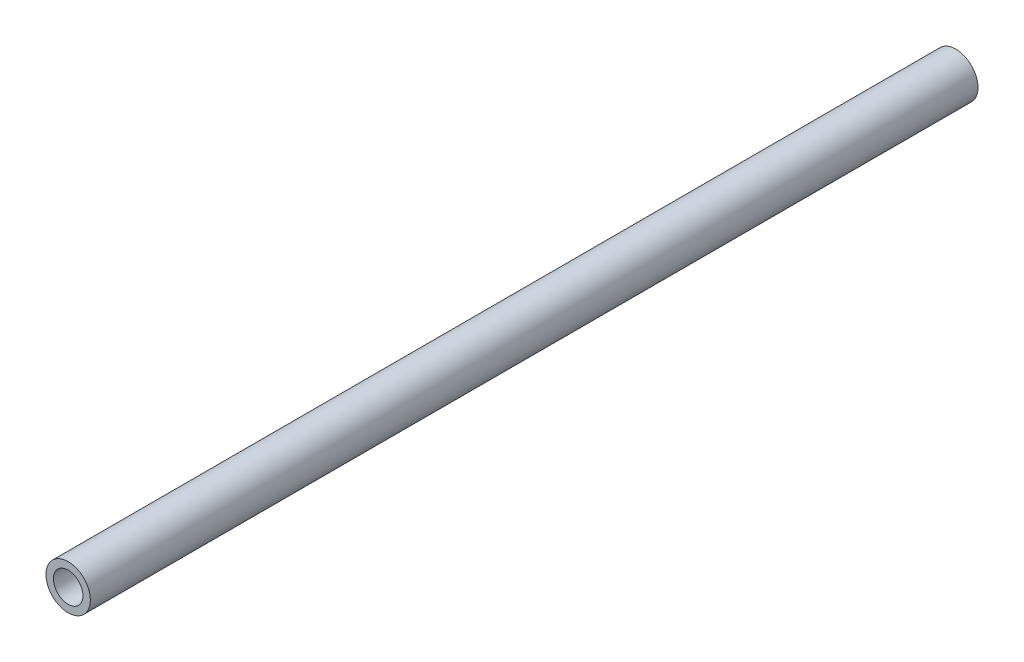
ISO-10303-21;
HEADER;
FILE_DESCRIPTION(('STEP AP214'),'2;1');
FILE_NAME('part.step','',(''),(''),'','','');
FILE_SCHEMA(('AUTOMOTIVE_DESIGN { 1 0 10303 214 1 1 1 1 }'));
ENDSEC;
DATA;
#1=APPLICATION_CONTEXT('core data for automotive mechanical design processes');
#2=APPLICATION_PROTOCOL_DEFINITION('international standard','automotive_design',2000,#1);
#3=PRODUCT_CONTEXT('',#1,'mechanical');
#4=PRODUCT('Part','Part','',(#3));
#5=PRODUCT_RELATED_PRODUCT_CATEGORY('part','',(#4));
#6=PRODUCT_DEFINITION_FORMATION('','',#4);
#7=PRODUCT_DEFINITION_CONTEXT('part definition',#1,'design');
#8=PRODUCT_DEFINITION('design','',#6,#7);
#9=PRODUCT_DEFINITION_SHAPE('','',#8);
#10=(LENGTH_UNIT() NAMED_UNIT(*) SI_UNIT(.MILLI.,.METRE.));
#11=(NAMED_UNIT(*) PLANE_ANGLE_UNIT() SI_UNIT($,.RADIAN.));
#12=(NAMED_UNIT(*) SI_UNIT($,.STERADIAN.) SOLID_ANGLE_UNIT());
#13=UNCERTAINTY_MEASURE_WITH_UNIT(LENGTH_MEASURE(1.E-05),#10,'distance_accuracy_value','');
#14=(GEOMETRIC_REPRESENTATION_CONTEXT(3) GLOBAL_UNCERTAINTY_ASSIGNED_CONTEXT((#13)) GLOBAL_UNIT_ASSIGNED_CONTEXT((#10,
#11,#12)) REPRESENTATION_CONTEXT('',''));
#15=CARTESIAN_POINT('',(0.,0.,0.));
#16=DIRECTION('',(0.,0.,1.));
#17=DIRECTION('',(1.,0.,0.));
#18=AXIS2_PLACEMENT_3D('',#15,#16,#17);
#19=CARTESIAN_POINT('',(0.,0.,381.));
#20=DIRECTION('',(0.,0.,1.));
#21=DIRECTION('',(1.,0.,0.));
#22=AXIS2_PLACEMENT_3D('',#19,#20,#21);
#23=PLANE('',#22);
#24=CARTESIAN_POINT('',(0.,0.,381.));
#25=DIRECTION('',(0.,0.,1.));
#26=DIRECTION('',(1.,0.,0.));
#27=AXIS2_PLACEMENT_3D('',#24,#25,#26);
#28=CIRCLE('',#27,9.525);
#29=CARTESIAN_POINT('',(9.525,0.,381.));
#30=VERTEX_POINT('',#29);
#31=EDGE_CURVE('E10',#30,#30,#28,.T.);
#32=ORIENTED_EDGE('',*,*,#31,.T.);
#33=EDGE_LOOP('',(#32));
#34=FACE_BOUND('',#33,.T.);
#35=CARTESIAN_POINT('',(0.,0.,381.));
#36=DIRECTION('',(0.,0.,1.));
#37=DIRECTION('',(1.,0.,0.));
#38=AXIS2_PLACEMENT_3D('',#35,#36,#37);
#39=CIRCLE('',#38,6.35);
#40=CARTESIAN_POINT('',(6.35,0.,381.));
#41=VERTEX_POINT('',#40);
#42=EDGE_CURVE('E53',#41,#41,#39,.T.);
#43=ORIENTED_EDGE('',*,*,#42,.F.);
#44=EDGE_LOOP('',(#43));
#45=FACE_BOUND('',#44,.T.);
#46=ADVANCED_FACE('F42',(#34,#45),#23,.T.);
#47=CARTESIAN_POINT('',(0.,0.,0.));
#48=DIRECTION('',(0.,0.,1.));
#49=DIRECTION('',(1.,0.,0.));
#50=AXIS2_PLACEMENT_3D('',#47,#48,#49);
#51=PLANE('',#50);
#52=CARTESIAN_POINT('',(0.,0.,0.));
#53=DIRECTION('',(0.,0.,1.));
#54=DIRECTION('',(1.,0.,0.));
#55=AXIS2_PLACEMENT_3D('',#52,#53,#54);
#56=CIRCLE('',#55,9.525);
#57=CARTESIAN_POINT('',(9.525,0.,0.));
#58=VERTEX_POINT('',#57);
#59=EDGE_CURVE('E46',#58,#58,#56,.T.);
#60=ORIENTED_EDGE('',*,*,#59,.F.);
#61=EDGE_LOOP('',(#60));
#62=FACE_BOUND('',#61,.T.);
#63=CARTESIAN_POINT('',(0.,0.,0.));
#64=DIRECTION('',(0.,0.,1.));
#65=DIRECTION('',(1.,0.,0.));
#66=AXIS2_PLACEMENT_3D('',#63,#64,#65);
#67=CIRCLE('',#66,6.35);
#68=CARTESIAN_POINT('',(6.35,0.,0.));
#69=VERTEX_POINT('',#68);
#70=EDGE_CURVE('E55',#69,#69,#67,.T.);
#71=ORIENTED_EDGE('',*,*,#70,.T.);
#72=EDGE_LOOP('',(#71));
#73=FACE_BOUND('',#72,.T.);
#74=ADVANCED_FACE('F65',(#62,#73),#51,.F.);
#75=CARTESIAN_POINT('',(0.,0.,381.));
#76=DIRECTION('',(0.,0.,-1.));
#77=DIRECTION('',(-1.,0.,0.));
#78=AXIS2_PLACEMENT_3D('',#75,#76,#77);
#79=CYLINDRICAL_SURFACE('',#78,9.525);
#80=ORIENTED_EDGE('',*,*,#31,.F.);
#81=EDGE_LOOP('',(#80));
#82=FACE_BOUND('',#81,.T.);
#83=ORIENTED_EDGE('',*,*,#59,.T.);
#84=EDGE_LOOP('',(#83));
#85=FACE_BOUND('',#84,.T.);
#86=ADVANCED_FACE('F44',(#82,#85),#79,.T.);
#87=CARTESIAN_POINT('',(0.,0.,381.));
#88=DIRECTION('',(0.,0.,-1.));
#89=DIRECTION('',(-1.,0.,0.));
#90=AXIS2_PLACEMENT_3D('',#87,#88,#89);
#91=CYLINDRICAL_SURFACE('',#90,6.35);
#92=ORIENTED_EDGE('',*,*,#42,.T.);
#93=EDGE_LOOP('',(#92));
#94=FACE_BOUND('',#93,.T.);
#95=ORIENTED_EDGE('',*,*,#70,.F.);
#96=EDGE_LOOP('',(#95));
#97=FACE_BOUND('',#96,.T.);
#98=ADVANCED_FACE('F61',(#94,#97),#91,.F.);
#99=CLOSED_SHELL('',(#46,#74,#86,#98));
#100=MANIFOLD_SOLID_BREP('B2',#99);
#101=ADVANCED_BREP_SHAPE_REPRESENTATION('',(#18,#100),#14);
#102=SHAPE_DEFINITION_REPRESENTATION(#9,#101);
ENDSEC;
END-ISO-10303-21;
